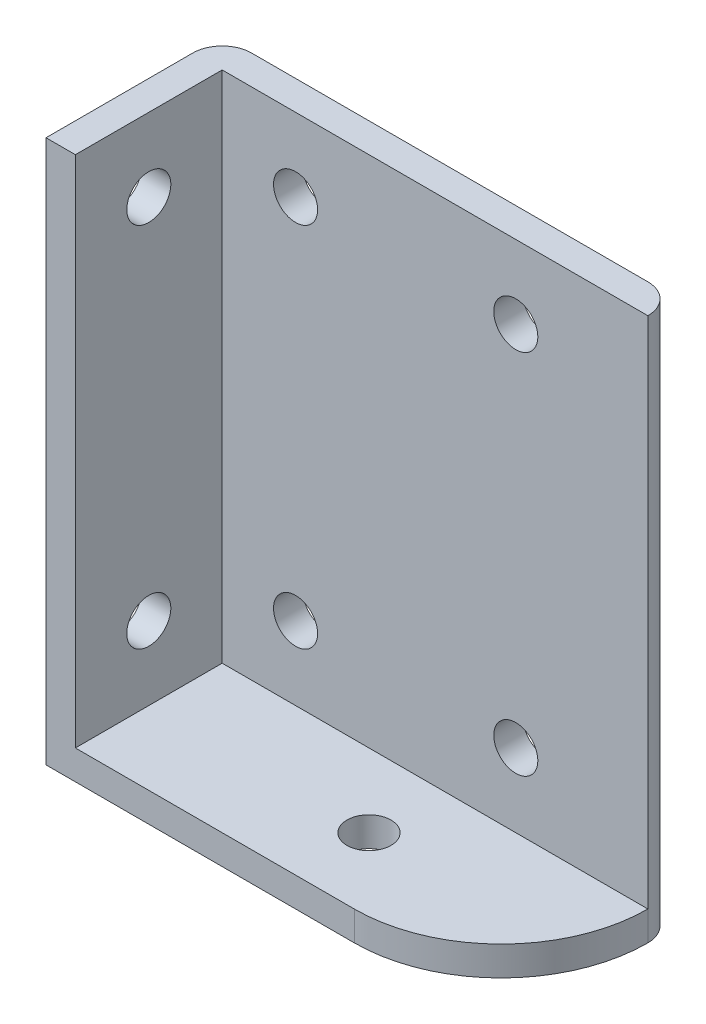
ISO-10303-21;
HEADER;
FILE_DESCRIPTION(('STEP AP214'),'2;1');
FILE_NAME('part.step','',(''),(''),'','','');
FILE_SCHEMA(('AUTOMOTIVE_DESIGN { 1 0 10303 214 1 1 1 1 }'));
ENDSEC;
DATA;
#1=APPLICATION_CONTEXT('core data for automotive mechanical design processes');
#2=APPLICATION_PROTOCOL_DEFINITION('international standard','automotive_design',2000,#1);
#3=PRODUCT_CONTEXT('',#1,'mechanical');
#4=PRODUCT('Part','Part','',(#3));
#5=PRODUCT_RELATED_PRODUCT_CATEGORY('part','',(#4));
#6=PRODUCT_DEFINITION_FORMATION('','',#4);
#7=PRODUCT_DEFINITION_CONTEXT('part definition',#1,'design');
#8=PRODUCT_DEFINITION('design','',#6,#7);
#9=PRODUCT_DEFINITION_SHAPE('','',#8);
#10=(LENGTH_UNIT() NAMED_UNIT(*) SI_UNIT(.MILLI.,.METRE.));
#11=(NAMED_UNIT(*) PLANE_ANGLE_UNIT() SI_UNIT($,.RADIAN.));
#12=(NAMED_UNIT(*) SI_UNIT($,.STERADIAN.) SOLID_ANGLE_UNIT());
#13=UNCERTAINTY_MEASURE_WITH_UNIT(LENGTH_MEASURE(1.E-05),#10,'distance_accuracy_value','');
#14=(GEOMETRIC_REPRESENTATION_CONTEXT(3) GLOBAL_UNCERTAINTY_ASSIGNED_CONTEXT((#13)) GLOBAL_UNIT_ASSIGNED_CONTEXT((#10,
#11,#12)) REPRESENTATION_CONTEXT('',''));
#15=CARTESIAN_POINT('',(0.,0.,0.));
#16=DIRECTION('',(0.,0.,1.));
#17=DIRECTION('',(1.,0.,0.));
#18=AXIS2_PLACEMENT_3D('',#15,#16,#17);
#19=CARTESIAN_POINT('',(42.,4.,4.));
#20=DIRECTION('',(0.,-1.,0.));
#21=DIRECTION('',(0.,0.,1.));
#22=AXIS2_PLACEMENT_3D('',#19,#20,#21);
#23=PLANE('',#22);
#24=CARTESIAN_POINT('',(34.,4.,14.));
#25=DIRECTION('',(0.,-1.,0.));
#26=DIRECTION('',(0.,0.,-1.));
#27=AXIS2_PLACEMENT_3D('',#24,#25,#26);
#28=CIRCLE('',#27,3.);
#29=CARTESIAN_POINT('',(34.,4.,11.));
#30=VERTEX_POINT('',#29);
#31=EDGE_CURVE('E157',#30,#30,#28,.T.);
#32=ORIENTED_EDGE('',*,*,#31,.T.);
#33=EDGE_LOOP('',(#32));
#34=FACE_BOUND('',#33,.T.);
#35=DIRECTION('',(0.,0.,1.));
#36=VECTOR('',#35,1.);
#37=CARTESIAN_POINT('',(4.,4.,24.));
#38=LINE('',#37,#36);
#39=CARTESIAN_POINT('',(4.,4.,4.));
#40=VERTEX_POINT('',#39);
#41=CARTESIAN_POINT('',(4.,4.,24.));
#42=VERTEX_POINT('',#41);
#43=EDGE_CURVE('E127',#40,#42,#38,.T.);
#44=ORIENTED_EDGE('',*,*,#43,.T.);
#45=DIRECTION('',(-1.,0.,0.));
#46=VECTOR('',#45,1.);
#47=CARTESIAN_POINT('',(0.,4.,24.));
#48=LINE('',#47,#46);
#49=CARTESIAN_POINT('',(42.,4.,24.));
#50=VERTEX_POINT('',#49);
#51=EDGE_CURVE('E91',#50,#42,#48,.T.);
#52=ORIENTED_EDGE('',*,*,#51,.F.);
#53=CARTESIAN_POINT('',(42.,4.,4.));
#54=DIRECTION('',(0.,-1.,0.));
#55=DIRECTION('',(0.,0.,1.));
#56=AXIS2_PLACEMENT_3D('',#53,#54,#55);
#57=CIRCLE('',#56,20.);
#58=CARTESIAN_POINT('',(62.,4.,4.));
#59=VERTEX_POINT('',#58);
#60=EDGE_CURVE('E95',#59,#50,#57,.T.);
#61=ORIENTED_EDGE('',*,*,#60,.F.);
#62=DIRECTION('',(-1.,0.,0.));
#63=VECTOR('',#62,1.);
#64=CARTESIAN_POINT('',(4.,4.,4.));
#65=LINE('',#64,#63);
#66=EDGE_CURVE('E134',#59,#40,#65,.T.);
#67=ORIENTED_EDGE('',*,*,#66,.T.);
#68=EDGE_LOOP('',(#44,#52,#61,#67));
#69=FACE_BOUND('',#68,.T.);
#70=ADVANCED_FACE('F32',(#34,#69),#23,.F.);
#71=CARTESIAN_POINT('',(0.,4.,24.));
#72=DIRECTION('',(0.,0.,-1.));
#73=DIRECTION('',(1.,0.,0.));
#74=AXIS2_PLACEMENT_3D('',#71,#72,#73);
#75=PLANE('',#74);
#76=DIRECTION('',(-1.,0.,0.));
#77=VECTOR('',#76,1.);
#78=CARTESIAN_POINT('',(0.,0.,24.));
#79=LINE('',#78,#77);
#80=CARTESIAN_POINT('',(42.,0.,24.));
#81=VERTEX_POINT('',#80);
#82=CARTESIAN_POINT('',(0.,0.,24.));
#83=VERTEX_POINT('',#82);
#84=EDGE_CURVE('E86',#81,#83,#79,.T.);
#85=ORIENTED_EDGE('',*,*,#84,.F.);
#86=DIRECTION('',(0.,-1.,0.));
#87=VECTOR('',#86,1.);
#88=CARTESIAN_POINT('',(42.,4.,24.));
#89=LINE('',#88,#87);
#90=EDGE_CURVE('E57',#50,#81,#89,.T.);
#91=ORIENTED_EDGE('',*,*,#90,.F.);
#92=ORIENTED_EDGE('',*,*,#51,.T.);
#93=DIRECTION('',(0.,-1.,0.));
#94=VECTOR('',#93,1.);
#95=CARTESIAN_POINT('',(4.,74.,24.));
#96=LINE('',#95,#94);
#97=CARTESIAN_POINT('',(4.,74.,24.));
#98=VERTEX_POINT('',#97);
#99=EDGE_CURVE('E49',#98,#42,#96,.T.);
#100=ORIENTED_EDGE('',*,*,#99,.F.);
#101=DIRECTION('',(-1.,0.,0.));
#102=VECTOR('',#101,1.);
#103=CARTESIAN_POINT('',(4.,74.,24.));
#104=LINE('',#103,#102);
#105=CARTESIAN_POINT('',(0.,74.,24.));
#106=VERTEX_POINT('',#105);
#107=EDGE_CURVE('E147',#98,#106,#104,.T.);
#108=ORIENTED_EDGE('',*,*,#107,.T.);
#109=DIRECTION('',(0.,-1.,0.));
#110=VECTOR('',#109,1.);
#111=CARTESIAN_POINT('',(0.,4.,24.));
#112=LINE('',#111,#110);
#113=EDGE_CURVE('E11',#106,#83,#112,.T.);
#114=ORIENTED_EDGE('',*,*,#113,.T.);
#115=EDGE_LOOP('',(#85,#91,#92,#100,#108,#114));
#116=FACE_BOUND('',#115,.T.);
#117=ADVANCED_FACE('F34',(#116),#75,.F.);
#118=CARTESIAN_POINT('',(0.,4.,4.00000000000003));
#119=DIRECTION('',(1.,0.,0.));
#120=DIRECTION('',(0.,0.,1.));
#121=AXIS2_PLACEMENT_3D('',#118,#119,#120);
#122=PLANE('',#121);
#123=CARTESIAN_POINT('',(0.,14.,14.));
#124=DIRECTION('',(-1.,0.,0.));
#125=DIRECTION('',(0.,0.,1.));
#126=AXIS2_PLACEMENT_3D('',#123,#124,#125);
#127=CIRCLE('',#126,3.);
#128=CARTESIAN_POINT('',(0.,14.,17.));
#129=VERTEX_POINT('',#128);
#130=EDGE_CURVE('E166',#129,#129,#127,.T.);
#131=ORIENTED_EDGE('',*,*,#130,.F.);
#132=EDGE_LOOP('',(#131));
#133=FACE_BOUND('',#132,.T.);
#134=CARTESIAN_POINT('',(0.,64.,14.));
#135=DIRECTION('',(-1.,0.,0.));
#136=DIRECTION('',(0.,0.,1.));
#137=AXIS2_PLACEMENT_3D('',#134,#135,#136);
#138=CIRCLE('',#137,3.);
#139=CARTESIAN_POINT('',(0.,64.,17.));
#140=VERTEX_POINT('',#139);
#141=EDGE_CURVE('E160',#140,#140,#138,.T.);
#142=ORIENTED_EDGE('',*,*,#141,.F.);
#143=EDGE_LOOP('',(#142));
#144=FACE_BOUND('',#143,.T.);
#145=DIRECTION('',(0.,0.,-1.));
#146=VECTOR('',#145,1.);
#147=CARTESIAN_POINT('',(0.,0.,4.00000000000003));
#148=LINE('',#147,#146);
#149=CARTESIAN_POINT('',(0.,0.,4.00000000000003));
#150=VERTEX_POINT('',#149);
#151=EDGE_CURVE('E101',#83,#150,#148,.T.);
#152=ORIENTED_EDGE('',*,*,#151,.F.);
#153=ORIENTED_EDGE('',*,*,#113,.F.);
#154=DIRECTION('',(0.,0.,-1.));
#155=VECTOR('',#154,1.);
#156=CARTESIAN_POINT('',(0.,74.,24.));
#157=LINE('',#156,#155);
#158=CARTESIAN_POINT('',(0.,74.,4.00000000000003));
#159=VERTEX_POINT('',#158);
#160=EDGE_CURVE('E144',#106,#159,#157,.T.);
#161=ORIENTED_EDGE('',*,*,#160,.T.);
#162=DIRECTION('',(0.,-1.,0.));
#163=VECTOR('',#162,1.);
#164=CARTESIAN_POINT('',(0.,4.,4.00000000000003));
#165=LINE('',#164,#163);
#166=EDGE_CURVE('E41',#159,#150,#165,.T.);
#167=ORIENTED_EDGE('',*,*,#166,.T.);
#168=EDGE_LOOP('',(#152,#153,#161,#167));
#169=FACE_BOUND('',#168,.T.);
#170=ADVANCED_FACE('F221',(#133,#144,#169),#122,.F.);
#171=CARTESIAN_POINT('',(4.,4.,4.));
#172=DIRECTION('',(0.,-1.,0.));
#173=DIRECTION('',(0.,0.,1.));
#174=AXIS2_PLACEMENT_3D('',#171,#172,#173);
#175=CYLINDRICAL_SURFACE('',#174,4.);
#176=CARTESIAN_POINT('',(4.,0.,4.));
#177=DIRECTION('',(0.,-1.,0.));
#178=DIRECTION('',(0.,0.,-1.));
#179=AXIS2_PLACEMENT_3D('',#176,#177,#178);
#180=CIRCLE('',#179,4.);
#181=CARTESIAN_POINT('',(4.00000000000003,0.,0.));
#182=VERTEX_POINT('',#181);
#183=EDGE_CURVE('E104',#150,#182,#180,.T.);
#184=ORIENTED_EDGE('',*,*,#183,.F.);
#185=ORIENTED_EDGE('',*,*,#166,.F.);
#186=CARTESIAN_POINT('',(4.,74.,4.));
#187=DIRECTION('',(0.,-1.,0.));
#188=DIRECTION('',(0.,0.,-1.));
#189=AXIS2_PLACEMENT_3D('',#186,#187,#188);
#190=CIRCLE('',#189,4.);
#191=CARTESIAN_POINT('',(4.00000000000003,74.,0.));
#192=VERTEX_POINT('',#191);
#193=EDGE_CURVE('E141',#159,#192,#190,.T.);
#194=ORIENTED_EDGE('',*,*,#193,.T.);
#195=DIRECTION('',(0.,-1.,0.));
#196=VECTOR('',#195,1.);
#197=CARTESIAN_POINT('',(4.00000000000003,4.,0.));
#198=LINE('',#197,#196);
#199=EDGE_CURVE('E121',#192,#182,#198,.T.);
#200=ORIENTED_EDGE('',*,*,#199,.T.);
#201=EDGE_LOOP('',(#184,#185,#194,#200));
#202=FACE_BOUND('',#201,.T.);
#203=ADVANCED_FACE('F206',(#202),#175,.T.);
#204=CARTESIAN_POINT('',(4.00000000000003,4.,0.));
#205=DIRECTION('',(0.,0.,1.));
#206=DIRECTION('',(-1.,0.,0.));
#207=AXIS2_PLACEMENT_3D('',#204,#205,#206);
#208=PLANE('',#207);
#209=CARTESIAN_POINT('',(44.,64.,0.));
#210=DIRECTION('',(0.,0.,-1.));
#211=DIRECTION('',(-1.,0.,0.));
#212=AXIS2_PLACEMENT_3D('',#209,#210,#211);
#213=CIRCLE('',#212,3.);
#214=CARTESIAN_POINT('',(41.,64.,0.));
#215=VERTEX_POINT('',#214);
#216=EDGE_CURVE('E190',#215,#215,#213,.T.);
#217=ORIENTED_EDGE('',*,*,#216,.F.);
#218=EDGE_LOOP('',(#217));
#219=FACE_BOUND('',#218,.T.);
#220=CARTESIAN_POINT('',(14.,64.,0.));
#221=DIRECTION('',(0.,0.,-1.));
#222=DIRECTION('',(-1.,0.,0.));
#223=AXIS2_PLACEMENT_3D('',#220,#221,#222);
#224=CIRCLE('',#223,3.);
#225=CARTESIAN_POINT('',(11.,64.,0.));
#226=VERTEX_POINT('',#225);
#227=EDGE_CURVE('E184',#226,#226,#224,.T.);
#228=ORIENTED_EDGE('',*,*,#227,.F.);
#229=EDGE_LOOP('',(#228));
#230=FACE_BOUND('',#229,.T.);
#231=CARTESIAN_POINT('',(44.,14.,0.));
#232=DIRECTION('',(0.,0.,-1.));
#233=DIRECTION('',(-1.,0.,0.));
#234=AXIS2_PLACEMENT_3D('',#231,#232,#233);
#235=CIRCLE('',#234,3.);
#236=CARTESIAN_POINT('',(41.,14.,0.));
#237=VERTEX_POINT('',#236);
#238=EDGE_CURVE('E178',#237,#237,#235,.T.);
#239=ORIENTED_EDGE('',*,*,#238,.F.);
#240=EDGE_LOOP('',(#239));
#241=FACE_BOUND('',#240,.T.);
#242=CARTESIAN_POINT('',(14.,14.,0.));
#243=DIRECTION('',(0.,0.,-1.));
#244=DIRECTION('',(-1.,0.,0.));
#245=AXIS2_PLACEMENT_3D('',#242,#243,#244);
#246=CIRCLE('',#245,3.);
#247=CARTESIAN_POINT('',(11.,14.,0.));
#248=VERTEX_POINT('',#247);
#249=EDGE_CURVE('E172',#248,#248,#246,.T.);
#250=ORIENTED_EDGE('',*,*,#249,.F.);
#251=EDGE_LOOP('',(#250));
#252=FACE_BOUND('',#251,.T.);
#253=DIRECTION('',(1.,0.,0.));
#254=VECTOR('',#253,1.);
#255=CARTESIAN_POINT('',(4.00000000000003,0.,0.));
#256=LINE('',#255,#254);
#257=CARTESIAN_POINT('',(58.,0.,0.));
#258=VERTEX_POINT('',#257);
#259=EDGE_CURVE('E114',#182,#258,#256,.T.);
#260=ORIENTED_EDGE('',*,*,#259,.F.);
#261=ORIENTED_EDGE('',*,*,#199,.F.);
#262=DIRECTION('',(1.,0.,0.));
#263=VECTOR('',#262,1.);
#264=CARTESIAN_POINT('',(4.00000000000003,74.,0.));
#265=LINE('',#264,#263);
#266=CARTESIAN_POINT('',(58.,74.,0.));
#267=VERTEX_POINT('',#266);
#268=EDGE_CURVE('E138',#192,#267,#265,.T.);
#269=ORIENTED_EDGE('',*,*,#268,.T.);
#270=DIRECTION('',(0.,-1.,0.));
#271=VECTOR('',#270,1.);
#272=CARTESIAN_POINT('',(58.,4.,0.));
#273=LINE('',#272,#271);
#274=EDGE_CURVE('E118',#267,#258,#273,.T.);
#275=ORIENTED_EDGE('',*,*,#274,.T.);
#276=EDGE_LOOP('',(#260,#261,#269,#275));
#277=FACE_BOUND('',#276,.T.);
#278=ADVANCED_FACE('F202',(#219,#230,#241,#252,#277),#208,.F.);
#279=CARTESIAN_POINT('',(58.,4.,4.));
#280=DIRECTION('',(0.,-1.,0.));
#281=DIRECTION('',(0.,0.,1.));
#282=AXIS2_PLACEMENT_3D('',#279,#280,#281);
#283=CYLINDRICAL_SURFACE('',#282,4.);
#284=CARTESIAN_POINT('',(58.,0.,4.));
#285=DIRECTION('',(0.,-1.,0.));
#286=DIRECTION('',(0.,0.,1.));
#287=AXIS2_PLACEMENT_3D('',#284,#285,#286);
#288=CIRCLE('',#287,4.);
#289=CARTESIAN_POINT('',(62.,0.,4.));
#290=VERTEX_POINT('',#289);
#291=EDGE_CURVE('E88',#258,#290,#288,.T.);
#292=ORIENTED_EDGE('',*,*,#291,.F.);
#293=ORIENTED_EDGE('',*,*,#274,.F.);
#294=CARTESIAN_POINT('',(58.,74.,4.));
#295=DIRECTION('',(0.,-1.,0.));
#296=DIRECTION('',(0.,0.,-1.));
#297=AXIS2_PLACEMENT_3D('',#294,#295,#296);
#298=CIRCLE('',#297,4.);
#299=CARTESIAN_POINT('',(62.,74.,4.));
#300=VERTEX_POINT('',#299);
#301=EDGE_CURVE('E154',#267,#300,#298,.T.);
#302=ORIENTED_EDGE('',*,*,#301,.T.);
#303=DIRECTION('',(0.,-1.,0.));
#304=VECTOR('',#303,1.);
#305=CARTESIAN_POINT('',(62.,74.,4.));
#306=LINE('',#305,#304);
#307=EDGE_CURVE('E102',#300,#59,#306,.T.);
#308=ORIENTED_EDGE('',*,*,#307,.T.);
#309=DIRECTION('',(0.,-1.,0.));
#310=VECTOR('',#309,1.);
#311=CARTESIAN_POINT('',(62.,4.,4.));
#312=LINE('',#311,#310);
#313=EDGE_CURVE('E97',#59,#290,#312,.T.);
#314=ORIENTED_EDGE('',*,*,#313,.T.);
#315=EDGE_LOOP('',(#292,#293,#302,#308,#314));
#316=FACE_BOUND('',#315,.T.);
#317=ADVANCED_FACE('F205',(#316),#283,.T.);
#318=CARTESIAN_POINT('',(42.,4.,4.));
#319=DIRECTION('',(0.,-1.,0.));
#320=DIRECTION('',(0.,0.,1.));
#321=AXIS2_PLACEMENT_3D('',#318,#319,#320);
#322=CYLINDRICAL_SURFACE('',#321,20.);
#323=CARTESIAN_POINT('',(42.,0.,4.));
#324=DIRECTION('',(0.,-1.,0.));
#325=DIRECTION('',(0.,0.,1.));
#326=AXIS2_PLACEMENT_3D('',#323,#324,#325);
#327=CIRCLE('',#326,20.);
#328=EDGE_CURVE('E83',#290,#81,#327,.T.);
#329=ORIENTED_EDGE('',*,*,#328,.F.);
#330=ORIENTED_EDGE('',*,*,#313,.F.);
#331=ORIENTED_EDGE('',*,*,#60,.T.);
#332=ORIENTED_EDGE('',*,*,#90,.T.);
#333=EDGE_LOOP('',(#329,#330,#331,#332));
#334=FACE_BOUND('',#333,.T.);
#335=ADVANCED_FACE('F93',(#334),#322,.T.);
#336=CARTESIAN_POINT('',(42.,0.,4.));
#337=DIRECTION('',(0.,-1.,0.));
#338=DIRECTION('',(0.,0.,1.));
#339=AXIS2_PLACEMENT_3D('',#336,#337,#338);
#340=PLANE('',#339);
#341=CARTESIAN_POINT('',(34.,0.,14.));
#342=DIRECTION('',(0.,-1.,0.));
#343=DIRECTION('',(0.,0.,-1.));
#344=AXIS2_PLACEMENT_3D('',#341,#342,#343);
#345=CIRCLE('',#344,3.);
#346=CARTESIAN_POINT('',(34.,0.,11.));
#347=VERTEX_POINT('',#346);
#348=EDGE_CURVE('E137',#347,#347,#345,.T.);
#349=ORIENTED_EDGE('',*,*,#348,.F.);
#350=EDGE_LOOP('',(#349));
#351=FACE_BOUND('',#350,.T.);
#352=ORIENTED_EDGE('',*,*,#84,.T.);
#353=ORIENTED_EDGE('',*,*,#151,.T.);
#354=ORIENTED_EDGE('',*,*,#183,.T.);
#355=ORIENTED_EDGE('',*,*,#259,.T.);
#356=ORIENTED_EDGE('',*,*,#291,.T.);
#357=ORIENTED_EDGE('',*,*,#328,.T.);
#358=EDGE_LOOP('',(#352,#353,#354,#355,#356,#357));
#359=FACE_BOUND('',#358,.T.);
#360=ADVANCED_FACE('F84',(#351,#359),#340,.T.);
#361=CARTESIAN_POINT('',(4.,74.,4.));
#362=DIRECTION('',(0.,0.,-1.));
#363=DIRECTION('',(1.,0.,0.));
#364=AXIS2_PLACEMENT_3D('',#361,#362,#363);
#365=PLANE('',#364);
#366=CARTESIAN_POINT('',(44.,64.,4.));
#367=DIRECTION('',(0.,0.,-1.));
#368=DIRECTION('',(-1.,0.,0.));
#369=AXIS2_PLACEMENT_3D('',#366,#367,#368);
#370=CIRCLE('',#369,3.);
#371=CARTESIAN_POINT('',(41.,64.,4.));
#372=VERTEX_POINT('',#371);
#373=EDGE_CURVE('E193',#372,#372,#370,.T.);
#374=ORIENTED_EDGE('',*,*,#373,.T.);
#375=EDGE_LOOP('',(#374));
#376=FACE_BOUND('',#375,.T.);
#377=CARTESIAN_POINT('',(14.,64.,4.));
#378=DIRECTION('',(0.,0.,-1.));
#379=DIRECTION('',(-1.,0.,0.));
#380=AXIS2_PLACEMENT_3D('',#377,#378,#379);
#381=CIRCLE('',#380,3.);
#382=CARTESIAN_POINT('',(11.,64.,4.));
#383=VERTEX_POINT('',#382);
#384=EDGE_CURVE('E187',#383,#383,#381,.T.);
#385=ORIENTED_EDGE('',*,*,#384,.T.);
#386=EDGE_LOOP('',(#385));
#387=FACE_BOUND('',#386,.T.);
#388=CARTESIAN_POINT('',(44.,14.,4.));
#389=DIRECTION('',(0.,0.,-1.));
#390=DIRECTION('',(-1.,0.,0.));
#391=AXIS2_PLACEMENT_3D('',#388,#389,#390);
#392=CIRCLE('',#391,3.);
#393=CARTESIAN_POINT('',(41.,14.,4.));
#394=VERTEX_POINT('',#393);
#395=EDGE_CURVE('E181',#394,#394,#392,.T.);
#396=ORIENTED_EDGE('',*,*,#395,.T.);
#397=EDGE_LOOP('',(#396));
#398=FACE_BOUND('',#397,.T.);
#399=CARTESIAN_POINT('',(14.,14.,4.));
#400=DIRECTION('',(0.,0.,-1.));
#401=DIRECTION('',(-1.,0.,0.));
#402=AXIS2_PLACEMENT_3D('',#399,#400,#401);
#403=CIRCLE('',#402,3.);
#404=CARTESIAN_POINT('',(11.,14.,4.));
#405=VERTEX_POINT('',#404);
#406=EDGE_CURVE('E175',#405,#405,#403,.T.);
#407=ORIENTED_EDGE('',*,*,#406,.T.);
#408=EDGE_LOOP('',(#407));
#409=FACE_BOUND('',#408,.T.);
#410=ORIENTED_EDGE('',*,*,#66,.F.);
#411=ORIENTED_EDGE('',*,*,#307,.F.);
#412=DIRECTION('',(-1.,0.,0.));
#413=VECTOR('',#412,1.);
#414=CARTESIAN_POINT('',(4.,74.,4.));
#415=LINE('',#414,#413);
#416=CARTESIAN_POINT('',(4.,74.,4.));
#417=VERTEX_POINT('',#416);
#418=EDGE_CURVE('E151',#300,#417,#415,.T.);
#419=ORIENTED_EDGE('',*,*,#418,.T.);
#420=DIRECTION('',(0.,-1.,0.));
#421=VECTOR('',#420,1.);
#422=CARTESIAN_POINT('',(4.,74.,4.));
#423=LINE('',#422,#421);
#424=EDGE_CURVE('E107',#417,#40,#423,.T.);
#425=ORIENTED_EDGE('',*,*,#424,.T.);
#426=EDGE_LOOP('',(#410,#411,#419,#425));
#427=FACE_BOUND('',#426,.T.);
#428=ADVANCED_FACE('F250',(#376,#387,#398,#409,#427),#365,.F.);
#429=CARTESIAN_POINT('',(4.,74.,24.));
#430=DIRECTION('',(-1.,0.,0.));
#431=DIRECTION('',(0.,0.,-1.));
#432=AXIS2_PLACEMENT_3D('',#429,#430,#431);
#433=PLANE('',#432);
#434=CARTESIAN_POINT('',(4.,14.,14.));
#435=DIRECTION('',(-1.,0.,0.));
#436=DIRECTION('',(0.,0.,1.));
#437=AXIS2_PLACEMENT_3D('',#434,#435,#436);
#438=CIRCLE('',#437,3.);
#439=CARTESIAN_POINT('',(4.,14.,17.));
#440=VERTEX_POINT('',#439);
#441=EDGE_CURVE('E169',#440,#440,#438,.T.);
#442=ORIENTED_EDGE('',*,*,#441,.T.);
#443=EDGE_LOOP('',(#442));
#444=FACE_BOUND('',#443,.T.);
#445=CARTESIAN_POINT('',(4.,64.,14.));
#446=DIRECTION('',(-1.,0.,0.));
#447=DIRECTION('',(0.,0.,1.));
#448=AXIS2_PLACEMENT_3D('',#445,#446,#447);
#449=CIRCLE('',#448,3.);
#450=CARTESIAN_POINT('',(4.,64.,17.));
#451=VERTEX_POINT('',#450);
#452=EDGE_CURVE('E163',#451,#451,#449,.T.);
#453=ORIENTED_EDGE('',*,*,#452,.T.);
#454=EDGE_LOOP('',(#453));
#455=FACE_BOUND('',#454,.T.);
#456=ORIENTED_EDGE('',*,*,#43,.F.);
#457=ORIENTED_EDGE('',*,*,#424,.F.);
#458=DIRECTION('',(0.,0.,1.));
#459=VECTOR('',#458,1.);
#460=CARTESIAN_POINT('',(4.,74.,24.));
#461=LINE('',#460,#459);
#462=EDGE_CURVE('E149',#417,#98,#461,.T.);
#463=ORIENTED_EDGE('',*,*,#462,.T.);
#464=ORIENTED_EDGE('',*,*,#99,.T.);
#465=EDGE_LOOP('',(#456,#457,#463,#464));
#466=FACE_BOUND('',#465,.T.);
#467=ADVANCED_FACE('F246',(#444,#455,#466),#433,.F.);
#468=CARTESIAN_POINT('',(58.,74.,4.));
#469=DIRECTION('',(0.,1.,0.));
#470=DIRECTION('',(0.,0.,-1.));
#471=AXIS2_PLACEMENT_3D('',#468,#469,#470);
#472=PLANE('',#471);
#473=ORIENTED_EDGE('',*,*,#301,.F.);
#474=ORIENTED_EDGE('',*,*,#268,.F.);
#475=ORIENTED_EDGE('',*,*,#193,.F.);
#476=ORIENTED_EDGE('',*,*,#160,.F.);
#477=ORIENTED_EDGE('',*,*,#107,.F.);
#478=ORIENTED_EDGE('',*,*,#462,.F.);
#479=ORIENTED_EDGE('',*,*,#418,.F.);
#480=EDGE_LOOP('',(#473,#474,#475,#476,#477,#478,#479));
#481=FACE_BOUND('',#480,.T.);
#482=ADVANCED_FACE('F247',(#481),#472,.T.);
#483=CARTESIAN_POINT('',(34.,0.,14.));
#484=DIRECTION('',(0.,1.,0.));
#485=DIRECTION('',(0.,0.,-1.));
#486=AXIS2_PLACEMENT_3D('',#483,#484,#485);
#487=CYLINDRICAL_SURFACE('',#486,3.);
#488=ORIENTED_EDGE('',*,*,#348,.T.);
#489=EDGE_LOOP('',(#488));
#490=FACE_BOUND('',#489,.T.);
#491=ORIENTED_EDGE('',*,*,#31,.F.);
#492=EDGE_LOOP('',(#491));
#493=FACE_BOUND('',#492,.T.);
#494=ADVANCED_FACE('F275',(#490,#493),#487,.F.);
#495=CARTESIAN_POINT('',(0.,64.,14.));
#496=DIRECTION('',(1.,0.,0.));
#497=DIRECTION('',(0.,0.,1.));
#498=AXIS2_PLACEMENT_3D('',#495,#496,#497);
#499=CYLINDRICAL_SURFACE('',#498,3.);
#500=ORIENTED_EDGE('',*,*,#141,.T.);
#501=EDGE_LOOP('',(#500));
#502=FACE_BOUND('',#501,.T.);
#503=ORIENTED_EDGE('',*,*,#452,.F.);
#504=EDGE_LOOP('',(#503));
#505=FACE_BOUND('',#504,.T.);
#506=ADVANCED_FACE('F278',(#502,#505),#499,.F.);
#507=CARTESIAN_POINT('',(0.,14.,14.));
#508=DIRECTION('',(1.,0.,0.));
#509=DIRECTION('',(0.,0.,1.));
#510=AXIS2_PLACEMENT_3D('',#507,#508,#509);
#511=CYLINDRICAL_SURFACE('',#510,3.);
#512=ORIENTED_EDGE('',*,*,#130,.T.);
#513=EDGE_LOOP('',(#512));
#514=FACE_BOUND('',#513,.T.);
#515=ORIENTED_EDGE('',*,*,#441,.F.);
#516=EDGE_LOOP('',(#515));
#517=FACE_BOUND('',#516,.T.);
#518=ADVANCED_FACE('F285',(#514,#517),#511,.F.);
#519=CARTESIAN_POINT('',(14.,14.,0.));
#520=DIRECTION('',(0.,0.,1.));
#521=DIRECTION('',(-1.,0.,0.));
#522=AXIS2_PLACEMENT_3D('',#519,#520,#521);
#523=CYLINDRICAL_SURFACE('',#522,3.);
#524=ORIENTED_EDGE('',*,*,#249,.T.);
#525=EDGE_LOOP('',(#524));
#526=FACE_BOUND('',#525,.T.);
#527=ORIENTED_EDGE('',*,*,#406,.F.);
#528=EDGE_LOOP('',(#527));
#529=FACE_BOUND('',#528,.T.);
#530=ADVANCED_FACE('F300',(#526,#529),#523,.F.);
#531=CARTESIAN_POINT('',(44.,14.,0.));
#532=DIRECTION('',(0.,0.,1.));
#533=DIRECTION('',(-1.,0.,0.));
#534=AXIS2_PLACEMENT_3D('',#531,#532,#533);
#535=CYLINDRICAL_SURFACE('',#534,3.);
#536=ORIENTED_EDGE('',*,*,#238,.T.);
#537=EDGE_LOOP('',(#536));
#538=FACE_BOUND('',#537,.T.);
#539=ORIENTED_EDGE('',*,*,#395,.F.);
#540=EDGE_LOOP('',(#539));
#541=FACE_BOUND('',#540,.T.);
#542=ADVANCED_FACE('F305',(#538,#541),#535,.F.);
#543=CARTESIAN_POINT('',(14.,64.,0.));
#544=DIRECTION('',(0.,0.,1.));
#545=DIRECTION('',(-1.,0.,0.));
#546=AXIS2_PLACEMENT_3D('',#543,#544,#545);
#547=CYLINDRICAL_SURFACE('',#546,3.);
#548=ORIENTED_EDGE('',*,*,#227,.T.);
#549=EDGE_LOOP('',(#548));
#550=FACE_BOUND('',#549,.T.);
#551=ORIENTED_EDGE('',*,*,#384,.F.);
#552=EDGE_LOOP('',(#551));
#553=FACE_BOUND('',#552,.T.);
#554=ADVANCED_FACE('F311',(#550,#553),#547,.F.);
#555=CARTESIAN_POINT('',(44.,64.,0.));
#556=DIRECTION('',(0.,0.,1.));
#557=DIRECTION('',(-1.,0.,0.));
#558=AXIS2_PLACEMENT_3D('',#555,#556,#557);
#559=CYLINDRICAL_SURFACE('',#558,3.);
#560=ORIENTED_EDGE('',*,*,#216,.T.);
#561=EDGE_LOOP('',(#560));
#562=FACE_BOUND('',#561,.T.);
#563=ORIENTED_EDGE('',*,*,#373,.F.);
#564=EDGE_LOOP('',(#563));
#565=FACE_BOUND('',#564,.T.);
#566=ADVANCED_FACE('F199',(#562,#565),#559,.F.);
#567=CLOSED_SHELL('',(#70,#117,#170,#203,#278,#317,#335,#360,#428,#467,#482,#494,#506,#518,#530,
#542,#554,#566));
#568=MANIFOLD_SOLID_BREP('B2',#567);
#569=ADVANCED_BREP_SHAPE_REPRESENTATION('',(#18,#568),#14);
#570=SHAPE_DEFINITION_REPRESENTATION(#9,#569);
ENDSEC;
END-ISO-10303-21;
